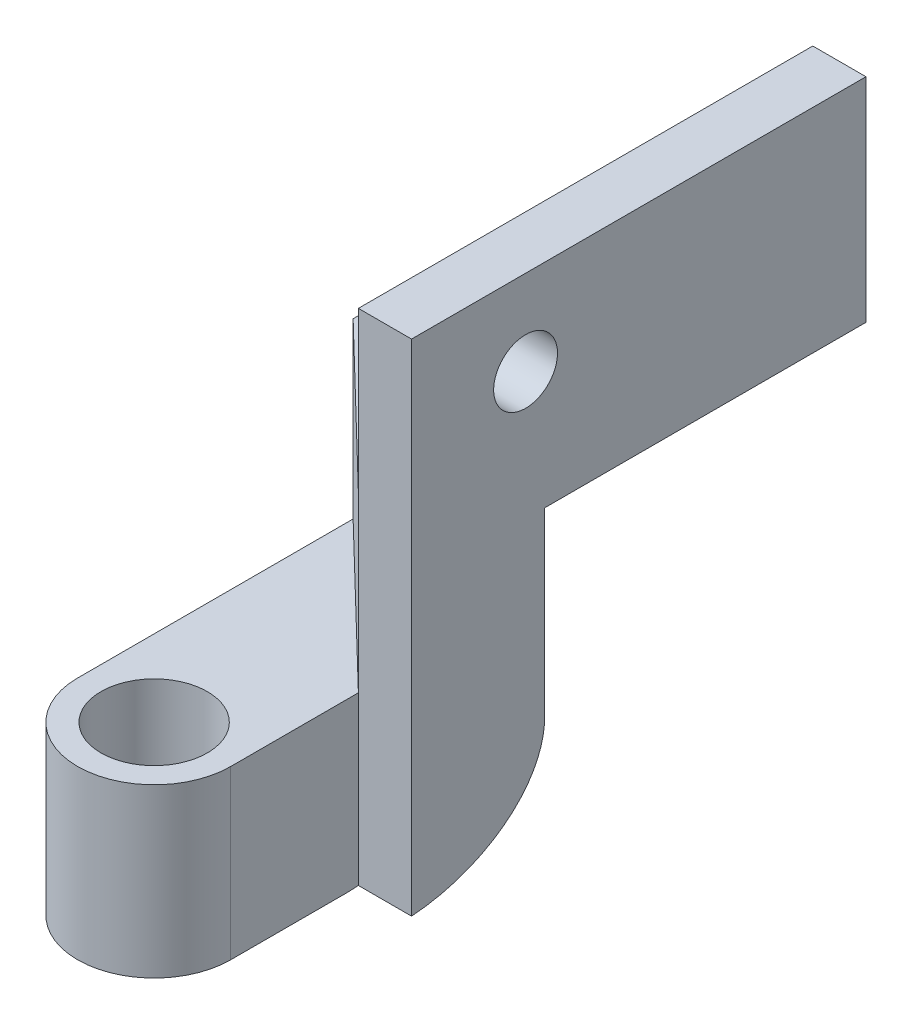
ISO-10303-21;
HEADER;
FILE_DESCRIPTION(('STEP AP214'),'2;1');
FILE_NAME('part.step','',(''),(''),'','','');
FILE_SCHEMA(('AUTOMOTIVE_DESIGN { 1 0 10303 214 1 1 1 1 }'));
ENDSEC;
DATA;
#1=APPLICATION_CONTEXT('core data for automotive mechanical design processes');
#2=APPLICATION_PROTOCOL_DEFINITION('international standard','automotive_design',2000,#1);
#3=PRODUCT_CONTEXT('',#1,'mechanical');
#4=PRODUCT('Part','Part','',(#3));
#5=PRODUCT_RELATED_PRODUCT_CATEGORY('part','',(#4));
#6=PRODUCT_DEFINITION_FORMATION('','',#4);
#7=PRODUCT_DEFINITION_CONTEXT('part definition',#1,'design');
#8=PRODUCT_DEFINITION('design','',#6,#7);
#9=PRODUCT_DEFINITION_SHAPE('','',#8);
#10=(LENGTH_UNIT() NAMED_UNIT(*) SI_UNIT(.MILLI.,.METRE.));
#11=(NAMED_UNIT(*) PLANE_ANGLE_UNIT() SI_UNIT($,.RADIAN.));
#12=(NAMED_UNIT(*) SI_UNIT($,.STERADIAN.) SOLID_ANGLE_UNIT());
#13=UNCERTAINTY_MEASURE_WITH_UNIT(LENGTH_MEASURE(1.E-05),#10,'distance_accuracy_value','');
#14=(GEOMETRIC_REPRESENTATION_CONTEXT(3) GLOBAL_UNCERTAINTY_ASSIGNED_CONTEXT((#13)) GLOBAL_UNIT_ASSIGNED_CONTEXT((#10,
#11,#12)) REPRESENTATION_CONTEXT('',''));
#15=CARTESIAN_POINT('',(0.,0.,0.));
#16=DIRECTION('',(0.,0.,1.));
#17=DIRECTION('',(1.,0.,0.));
#18=AXIS2_PLACEMENT_3D('',#15,#16,#17);
#19=CARTESIAN_POINT('',(3.59999999999999,-2.5,0.));
#20=DIRECTION('',(1.,0.,0.));
#21=DIRECTION('',(0.,0.,-1.));
#22=AXIS2_PLACEMENT_3D('',#19,#20,#21);
#23=PLANE('',#22);
#24=DIRECTION('',(0.,-1.,0.));
#25=VECTOR('',#24,1.);
#26=CARTESIAN_POINT('',(3.60000000000002,0.,-5.99999999999997));
#27=LINE('',#26,#25);
#28=CARTESIAN_POINT('',(3.60000000000002,-8.15,-5.99999999999997));
#29=VERTEX_POINT('',#28);
#30=CARTESIAN_POINT('',(3.60000000000002,-15.9949371855331,-5.99999999999998));
#31=VERTEX_POINT('',#30);
#32=EDGE_CURVE('E163',#29,#31,#27,.T.);
#33=ORIENTED_EDGE('',*,*,#32,.F.);
#34=DIRECTION('',(0.,0.,-1.));
#35=VECTOR('',#34,1.);
#36=CARTESIAN_POINT('',(3.59999999999999,-8.15,0.));
#37=LINE('',#36,#35);
#38=CARTESIAN_POINT('',(3.59999999999999,-8.15,0.));
#39=VERTEX_POINT('',#38);
#40=EDGE_CURVE('E183',#39,#29,#37,.T.);
#41=ORIENTED_EDGE('',*,*,#40,.F.);
#42=DIRECTION('',(0.,1.,0.));
#43=VECTOR('',#42,1.);
#44=CARTESIAN_POINT('',(3.59999999999999,-16.02,0.));
#45=LINE('',#44,#43);
#46=CARTESIAN_POINT('',(3.59999999999999,-16.02,0.));
#47=VERTEX_POINT('',#46);
#48=EDGE_CURVE('E186',#47,#39,#45,.T.);
#49=ORIENTED_EDGE('',*,*,#48,.F.);
#50=DIRECTION('',(0.,0.,1.));
#51=VECTOR('',#50,1.);
#52=CARTESIAN_POINT('',(3.59999999999999,-16.02,0.));
#53=LINE('',#52,#51);
#54=CARTESIAN_POINT('',(3.60000000000002,-16.02,-5.30491820449164));
#55=VERTEX_POINT('',#54);
#56=EDGE_CURVE('E194',#55,#47,#53,.T.);
#57=ORIENTED_EDGE('',*,*,#56,.F.);
#58=CARTESIAN_POINT('',(3.60000000000002,-11.02,-5.30491820449164));
#59=DIRECTION('',(1.,0.,0.));
#60=DIRECTION('',(0.,0.,-1.));
#61=AXIS2_PLACEMENT_3D('',#58,#59,#60);
#62=ELLIPSE('',#61,6.95081795508332,5.);
#63=EDGE_CURVE('E11',#55,#31,#62,.T.);
#64=ORIENTED_EDGE('',*,*,#63,.T.);
#65=EDGE_LOOP('',(#33,#41,#49,#57,#64));
#66=FACE_BOUND('',#65,.T.);
#67=ADVANCED_FACE('F41',(#66),#23,.T.);
#68=CARTESIAN_POINT('',(4.73535338699276,-2.5,-4.9036019787419));
#69=DIRECTION('',(-0.694658370458993,0.,0.719339800338655));
#70=DIRECTION('',(0.719339800338655,0.,0.694658370458993));
#71=AXIS2_PLACEMENT_3D('',#68,#69,#70);
#72=PLANE('',#71);
#73=DIRECTION('',(0.,1.,0.));
#74=VECTOR('',#73,1.);
#75=CARTESIAN_POINT('',(-3.59999999999999,-2.5,-12.9529591786108));
#76=LINE('',#75,#74);
#77=CARTESIAN_POINT('',(-3.59999999999999,-8.15,-12.9529591786108));
#78=VERTEX_POINT('',#77);
#79=CARTESIAN_POINT('',(-3.59999999999999,0.,-12.9529591786108));
#80=VERTEX_POINT('',#79);
#81=EDGE_CURVE('E215',#78,#80,#76,.T.);
#82=ORIENTED_EDGE('',*,*,#81,.F.);
#83=DIRECTION('',(0.719339800338655,0.,0.694658370458993));
#84=VECTOR('',#83,1.);
#85=CARTESIAN_POINT('',(4.73535338699276,-8.15,-4.9036019787419));
#86=LINE('',#85,#84);
#87=EDGE_CURVE('E174',#78,#29,#86,.T.);
#88=ORIENTED_EDGE('',*,*,#87,.T.);
#89=DIRECTION('',(0.,1.,0.));
#90=VECTOR('',#89,1.);
#91=CARTESIAN_POINT('',(3.60000000000002,-2.5,-5.99999999999997));
#92=LINE('',#91,#90);
#93=CARTESIAN_POINT('',(3.60000000000002,0.,-5.99999999999997));
#94=VERTEX_POINT('',#93);
#95=EDGE_CURVE('E226',#29,#94,#92,.T.);
#96=ORIENTED_EDGE('',*,*,#95,.T.);
#97=DIRECTION('',(0.719339800338655,0.,0.694658370458993));
#98=VECTOR('',#97,1.);
#99=CARTESIAN_POINT('',(4.73535338699276,0.,-4.9036019787419));
#100=LINE('',#99,#98);
#101=EDGE_CURVE('E220',#80,#94,#100,.T.);
#102=ORIENTED_EDGE('',*,*,#101,.F.);
#103=EDGE_LOOP('',(#82,#88,#96,#102));
#104=FACE_BOUND('',#103,.T.);
#105=ADVANCED_FACE('F307',(#104),#72,.T.);
#106=CARTESIAN_POINT('',(0.,-2.5,0.));
#107=DIRECTION('',(0.,1.,0.));
#108=DIRECTION('',(0.,0.,1.));
#109=AXIS2_PLACEMENT_3D('',#106,#107,#108);
#110=PLANE('',#109);
#111=CARTESIAN_POINT('',(-0.400000000000008,-2.5,-21.36));
#112=DIRECTION('',(0.,1.,0.));
#113=DIRECTION('',(0.,0.,1.));
#114=AXIS2_PLACEMENT_3D('',#111,#112,#113);
#115=CIRCLE('',#114,1.5);
#116=CARTESIAN_POINT('',(-0.400000000000008,-2.5,-19.86));
#117=VERTEX_POINT('',#116);
#118=EDGE_CURVE('E204',#117,#117,#115,.T.);
#119=ORIENTED_EDGE('',*,*,#118,.T.);
#120=EDGE_LOOP('',(#119));
#121=FACE_BOUND('',#120,.T.);
#122=DIRECTION('',(0.719339800338655,0.,0.694658370458993));
#123=VECTOR('',#122,1.);
#124=CARTESIAN_POINT('',(7.86131605405823,-2.5,-8.14063108026585));
#125=LINE('',#124,#123);
#126=CARTESIAN_POINT('',(-3.59999999999999,-2.5,-19.2086953381859));
#127=VERTEX_POINT('',#126);
#128=CARTESIAN_POINT('',(3.60000000000006,-2.5,-12.255736159575));
#129=VERTEX_POINT('',#128);
#130=EDGE_CURVE('E227',#127,#129,#125,.T.);
#131=ORIENTED_EDGE('',*,*,#130,.F.);
#132=DIRECTION('',(0.,0.,1.));
#133=VECTOR('',#132,1.);
#134=CARTESIAN_POINT('',(-3.59999999999999,-2.5,0.));
#135=LINE('',#134,#133);
#136=CARTESIAN_POINT('',(-3.6,-2.5,-27.36));
#137=VERTEX_POINT('',#136);
#138=EDGE_CURVE('E201',#137,#127,#135,.T.);
#139=ORIENTED_EDGE('',*,*,#138,.F.);
#140=DIRECTION('',(-1.,0.,0.));
#141=VECTOR('',#140,1.);
#142=CARTESIAN_POINT('',(0.,-2.5,-27.36));
#143=LINE('',#142,#141);
#144=CARTESIAN_POINT('',(6.10000000000014,-2.5,-27.3599999999999));
#145=VERTEX_POINT('',#144);
#146=EDGE_CURVE('E209',#145,#137,#143,.T.);
#147=ORIENTED_EDGE('',*,*,#146,.F.);
#148=DIRECTION('',(0.,0.,-1.));
#149=VECTOR('',#148,1.);
#150=CARTESIAN_POINT('',(6.09999999999999,-2.5,0.));
#151=LINE('',#150,#149);
#152=CARTESIAN_POINT('',(6.10000000000006,-2.5,-12.2557361595749));
#153=VERTEX_POINT('',#152);
#154=EDGE_CURVE('E260',#153,#145,#151,.T.);
#155=ORIENTED_EDGE('',*,*,#154,.F.);
#156=DIRECTION('',(-1.,0.,0.));
#157=VECTOR('',#156,1.);
#158=CARTESIAN_POINT('',(6.10000000000006,-2.5,-12.2557361595749));
#159=LINE('',#158,#157);
#160=EDGE_CURVE('E170',#153,#129,#159,.T.);
#161=ORIENTED_EDGE('',*,*,#160,.T.);
#162=EDGE_LOOP('',(#131,#139,#147,#155,#161));
#163=FACE_BOUND('',#162,.T.);
#164=ADVANCED_FACE('F244',(#121,#163),#110,.F.);
#165=CARTESIAN_POINT('',(-3.59999999999999,-2.5,0.));
#166=DIRECTION('',(-1.,0.,0.));
#167=DIRECTION('',(0.,0.,1.));
#168=AXIS2_PLACEMENT_3D('',#165,#166,#167);
#169=PLANE('',#168);
#170=DIRECTION('',(0.,1.,0.));
#171=VECTOR('',#170,1.);
#172=CARTESIAN_POINT('',(-3.59999999999999,-31.0635910784963,-19.2086953381859));
#173=LINE('',#172,#171);
#174=CARTESIAN_POINT('',(-3.59999999999999,-11.02,-19.2086953381859));
#175=VERTEX_POINT('',#174);
#176=EDGE_CURVE('E192',#175,#127,#173,.T.);
#177=ORIENTED_EDGE('',*,*,#176,.F.);
#178=CARTESIAN_POINT('',(-3.59999999999999,-11.02,-12.2578773831025));
#179=DIRECTION('',(-1.,0.,0.));
#180=DIRECTION('',(0.,0.,-1.));
#181=AXIS2_PLACEMENT_3D('',#178,#179,#180);
#182=ELLIPSE('',#181,6.95081795508336,5.);
#183=CARTESIAN_POINT('',(-3.59999999999999,-16.02,-12.2578773831025));
#184=VERTEX_POINT('',#183);
#185=EDGE_CURVE('E64',#175,#184,#182,.T.);
#186=ORIENTED_EDGE('',*,*,#185,.T.);
#187=DIRECTION('',(0.,0.,-1.));
#188=VECTOR('',#187,1.);
#189=CARTESIAN_POINT('',(-3.59999999999999,-16.02,0.));
#190=LINE('',#189,#188);
#191=CARTESIAN_POINT('',(-3.59999999999999,-16.02,0.));
#192=VERTEX_POINT('',#191);
#193=EDGE_CURVE('E193',#192,#184,#190,.T.);
#194=ORIENTED_EDGE('',*,*,#193,.F.);
#195=DIRECTION('',(0.,1.,0.));
#196=VECTOR('',#195,1.);
#197=CARTESIAN_POINT('',(-3.59999999999999,-16.02,0.));
#198=LINE('',#197,#196);
#199=CARTESIAN_POINT('',(-3.59999999999999,-8.15,0.));
#200=VERTEX_POINT('',#199);
#201=EDGE_CURVE('E180',#192,#200,#198,.T.);
#202=ORIENTED_EDGE('',*,*,#201,.T.);
#203=DIRECTION('',(0.,0.,1.));
#204=VECTOR('',#203,1.);
#205=CARTESIAN_POINT('',(-3.59999999999999,-8.15,0.));
#206=LINE('',#205,#204);
#207=EDGE_CURVE('E164',#78,#200,#206,.T.);
#208=ORIENTED_EDGE('',*,*,#207,.F.);
#209=ORIENTED_EDGE('',*,*,#81,.T.);
#210=DIRECTION('',(0.,0.,1.));
#211=VECTOR('',#210,1.);
#212=CARTESIAN_POINT('',(-3.59999999999999,0.,0.));
#213=LINE('',#212,#211);
#214=CARTESIAN_POINT('',(-3.6,0.,-27.36));
#215=VERTEX_POINT('',#214);
#216=EDGE_CURVE('E213',#215,#80,#213,.T.);
#217=ORIENTED_EDGE('',*,*,#216,.F.);
#218=DIRECTION('',(0.,1.,0.));
#219=VECTOR('',#218,1.);
#220=CARTESIAN_POINT('',(-3.6,-2.5,-27.36));
#221=LINE('',#220,#219);
#222=EDGE_CURVE('E221',#137,#215,#221,.T.);
#223=ORIENTED_EDGE('',*,*,#222,.F.);
#224=ORIENTED_EDGE('',*,*,#138,.T.);
#225=EDGE_LOOP('',(#177,#186,#194,#202,#208,#209,#217,#223,#224));
#226=FACE_BOUND('',#225,.T.);
#227=ADVANCED_FACE('F241',(#226),#169,.T.);
#228=CARTESIAN_POINT('',(0.,-2.5,-27.36));
#229=DIRECTION('',(0.,0.,-1.));
#230=DIRECTION('',(-1.,0.,0.));
#231=AXIS2_PLACEMENT_3D('',#228,#229,#230);
#232=PLANE('',#231);
#233=DIRECTION('',(-1.,0.,0.));
#234=VECTOR('',#233,1.);
#235=CARTESIAN_POINT('',(0.,0.,-27.36));
#236=LINE('',#235,#234);
#237=CARTESIAN_POINT('',(3.60000000000014,0.,-27.36));
#238=VERTEX_POINT('',#237);
#239=EDGE_CURVE('E207',#238,#215,#236,.T.);
#240=ORIENTED_EDGE('',*,*,#239,.F.);
#241=DIRECTION('',(0.,1.,0.));
#242=VECTOR('',#241,1.);
#243=CARTESIAN_POINT('',(3.60000000000014,0.,-27.36));
#244=LINE('',#243,#242);
#245=CARTESIAN_POINT('',(3.60000000000014,7.5,-27.36));
#246=VERTEX_POINT('',#245);
#247=EDGE_CURVE('E272',#238,#246,#244,.T.);
#248=ORIENTED_EDGE('',*,*,#247,.T.);
#249=DIRECTION('',(-1.,0.,0.));
#250=VECTOR('',#249,1.);
#251=CARTESIAN_POINT('',(6.10000000000014,7.5,-27.3599999999999));
#252=LINE('',#251,#250);
#253=CARTESIAN_POINT('',(6.10000000000014,7.5,-27.3599999999999));
#254=VERTEX_POINT('',#253);
#255=EDGE_CURVE('E257',#254,#246,#252,.T.);
#256=ORIENTED_EDGE('',*,*,#255,.F.);
#257=DIRECTION('',(0.,1.,0.));
#258=VECTOR('',#257,1.);
#259=CARTESIAN_POINT('',(6.10000000000014,0.,-27.3599999999999));
#260=LINE('',#259,#258);
#261=EDGE_CURVE('E251',#145,#254,#260,.T.);
#262=ORIENTED_EDGE('',*,*,#261,.F.);
#263=ORIENTED_EDGE('',*,*,#146,.T.);
#264=ORIENTED_EDGE('',*,*,#222,.T.);
#265=EDGE_LOOP('',(#240,#248,#256,#262,#263,#264));
#266=FACE_BOUND('',#265,.T.);
#267=ADVANCED_FACE('F255',(#266),#232,.T.);
#268=CARTESIAN_POINT('',(-0.400000000000008,-2.5,-21.36));
#269=DIRECTION('',(0.,1.,0.));
#270=DIRECTION('',(0.,0.,1.));
#271=AXIS2_PLACEMENT_3D('',#268,#269,#270);
#272=CYLINDRICAL_SURFACE('',#271,1.5);
#273=ORIENTED_EDGE('',*,*,#118,.F.);
#274=EDGE_LOOP('',(#273));
#275=FACE_BOUND('',#274,.T.);
#276=CARTESIAN_POINT('',(-0.400000000000008,0.,-21.36));
#277=DIRECTION('',(0.,1.,0.));
#278=DIRECTION('',(0.,0.,1.));
#279=AXIS2_PLACEMENT_3D('',#276,#277,#278);
#280=CIRCLE('',#279,1.5);
#281=CARTESIAN_POINT('',(-0.400000000000008,0.,-19.86));
#282=VERTEX_POINT('',#281);
#283=EDGE_CURVE('E203',#282,#282,#280,.T.);
#284=ORIENTED_EDGE('',*,*,#283,.T.);
#285=EDGE_LOOP('',(#284));
#286=FACE_BOUND('',#285,.T.);
#287=ADVANCED_FACE('F312',(#275,#286),#272,.F.);
#288=CARTESIAN_POINT('',(0.,0.,0.));
#289=DIRECTION('',(0.,1.,0.));
#290=DIRECTION('',(0.,0.,1.));
#291=AXIS2_PLACEMENT_3D('',#288,#289,#290);
#292=PLANE('',#291);
#293=DIRECTION('',(0.,0.,-1.));
#294=VECTOR('',#293,1.);
#295=CARTESIAN_POINT('',(3.59999999999999,0.,0.));
#296=LINE('',#295,#294);
#297=EDGE_CURVE('E223',#94,#238,#296,.T.);
#298=ORIENTED_EDGE('',*,*,#297,.T.);
#299=ORIENTED_EDGE('',*,*,#239,.T.);
#300=ORIENTED_EDGE('',*,*,#216,.T.);
#301=ORIENTED_EDGE('',*,*,#101,.T.);
#302=EDGE_LOOP('',(#298,#299,#300,#301));
#303=FACE_BOUND('',#302,.T.);
#304=ORIENTED_EDGE('',*,*,#283,.F.);
#305=EDGE_LOOP('',(#304));
#306=FACE_BOUND('',#305,.T.);
#307=ADVANCED_FACE('F306',(#303,#306),#292,.T.);
#308=CARTESIAN_POINT('',(7.86131605405823,-31.0635910784963,-8.14063108026585));
#309=DIRECTION('',(-0.694658370458993,0.,0.719339800338655));
#310=DIRECTION('',(0.719339800338655,0.,0.694658370458993));
#311=AXIS2_PLACEMENT_3D('',#308,#309,#310);
#312=PLANE('',#311);
#313=DIRECTION('',(0.,1.,0.));
#314=VECTOR('',#313,1.);
#315=CARTESIAN_POINT('',(3.60000000000006,-31.0635910784963,-12.255736159575));
#316=LINE('',#315,#314);
#317=CARTESIAN_POINT('',(3.60000000000006,-11.02,-12.255736159575));
#318=VERTEX_POINT('',#317);
#319=EDGE_CURVE('E199',#318,#129,#316,.T.);
#320=ORIENTED_EDGE('',*,*,#319,.F.);
#321=DIRECTION('',(-0.719339800338655,0.,-0.694658370458993));
#322=VECTOR('',#321,1.);
#323=CARTESIAN_POINT('',(7.86131605405823,-11.02,-8.14063108026585));
#324=LINE('',#323,#322);
#325=EDGE_CURVE('E235',#318,#175,#324,.T.);
#326=ORIENTED_EDGE('',*,*,#325,.T.);
#327=ORIENTED_EDGE('',*,*,#176,.T.);
#328=ORIENTED_EDGE('',*,*,#130,.T.);
#329=EDGE_LOOP('',(#320,#326,#327,#328));
#330=FACE_BOUND('',#329,.T.);
#331=ADVANCED_FACE('F240',(#330),#312,.F.);
#332=CARTESIAN_POINT('',(0.,-16.02,0.));
#333=DIRECTION('',(0.,1.,0.));
#334=DIRECTION('',(0.,0.,1.));
#335=AXIS2_PLACEMENT_3D('',#332,#333,#334);
#336=PLANE('',#335);
#337=ORIENTED_EDGE('',*,*,#193,.T.);
#338=DIRECTION('',(-0.719339800338655,0.,-0.694658370458993));
#339=VECTOR('',#338,1.);
#340=CARTESIAN_POINT('',(4.38802420176326,-16.02,-4.54393207857258));
#341=LINE('',#340,#339);
#342=EDGE_CURVE('E47',#184,#55,#341,.F.);
#343=ORIENTED_EDGE('',*,*,#342,.T.);
#344=ORIENTED_EDGE('',*,*,#56,.T.);
#345=CARTESIAN_POINT('',(0.,-16.02,0.));
#346=DIRECTION('',(0.,1.,0.));
#347=DIRECTION('',(0.,0.,1.));
#348=AXIS2_PLACEMENT_3D('',#345,#346,#347);
#349=CIRCLE('',#348,3.59999999999999);
#350=EDGE_CURVE('E172',#192,#47,#349,.T.);
#351=ORIENTED_EDGE('',*,*,#350,.F.);
#352=EDGE_LOOP('',(#337,#343,#344,#351));
#353=FACE_BOUND('',#352,.T.);
#354=CARTESIAN_POINT('',(0.,-16.02,0.));
#355=DIRECTION('',(0.,1.,0.));
#356=DIRECTION('',(0.,0.,1.));
#357=AXIS2_PLACEMENT_3D('',#354,#355,#356);
#358=CIRCLE('',#357,2.5);
#359=CARTESIAN_POINT('',(0.,-16.02,2.5));
#360=VERTEX_POINT('',#359);
#361=EDGE_CURVE('E171',#360,#360,#358,.T.);
#362=ORIENTED_EDGE('',*,*,#361,.T.);
#363=EDGE_LOOP('',(#362));
#364=FACE_BOUND('',#363,.T.);
#365=ADVANCED_FACE('F297',(#353,#364),#336,.F.);
#366=CARTESIAN_POINT('',(0.,-16.02,0.));
#367=DIRECTION('',(0.,1.,0.));
#368=DIRECTION('',(0.,0.,1.));
#369=AXIS2_PLACEMENT_3D('',#366,#367,#368);
#370=CYLINDRICAL_SURFACE('',#369,2.5);
#371=ORIENTED_EDGE('',*,*,#361,.F.);
#372=EDGE_LOOP('',(#371));
#373=FACE_BOUND('',#372,.T.);
#374=CARTESIAN_POINT('',(0.,-8.15,0.));
#375=DIRECTION('',(0.,1.,0.));
#376=DIRECTION('',(0.,0.,1.));
#377=AXIS2_PLACEMENT_3D('',#374,#375,#376);
#378=CIRCLE('',#377,2.5);
#379=CARTESIAN_POINT('',(0.,-8.15,2.5));
#380=VERTEX_POINT('',#379);
#381=EDGE_CURVE('E162',#380,#380,#378,.T.);
#382=ORIENTED_EDGE('',*,*,#381,.T.);
#383=EDGE_LOOP('',(#382));
#384=FACE_BOUND('',#383,.T.);
#385=ADVANCED_FACE('F298',(#373,#384),#370,.F.);
#386=CARTESIAN_POINT('',(0.,-16.02,0.));
#387=DIRECTION('',(0.,1.,0.));
#388=DIRECTION('',(0.,0.,1.));
#389=AXIS2_PLACEMENT_3D('',#386,#387,#388);
#390=CYLINDRICAL_SURFACE('',#389,3.59999999999999);
#391=CARTESIAN_POINT('',(0.,-8.15,0.));
#392=DIRECTION('',(0.,1.,0.));
#393=DIRECTION('',(0.,0.,1.));
#394=AXIS2_PLACEMENT_3D('',#391,#392,#393);
#395=CIRCLE('',#394,3.59999999999999);
#396=EDGE_CURVE('E181',#200,#39,#395,.T.);
#397=ORIENTED_EDGE('',*,*,#396,.F.);
#398=ORIENTED_EDGE('',*,*,#201,.F.);
#399=ORIENTED_EDGE('',*,*,#350,.T.);
#400=ORIENTED_EDGE('',*,*,#48,.T.);
#401=EDGE_LOOP('',(#397,#398,#399,#400));
#402=FACE_BOUND('',#401,.T.);
#403=ADVANCED_FACE('F292',(#402),#390,.T.);
#404=CARTESIAN_POINT('',(0.,-8.15,0.));
#405=DIRECTION('',(0.,1.,0.));
#406=DIRECTION('',(0.,0.,1.));
#407=AXIS2_PLACEMENT_3D('',#404,#405,#406);
#408=PLANE('',#407);
#409=ORIENTED_EDGE('',*,*,#381,.F.);
#410=EDGE_LOOP('',(#409));
#411=FACE_BOUND('',#410,.T.);
#412=ORIENTED_EDGE('',*,*,#207,.T.);
#413=ORIENTED_EDGE('',*,*,#396,.T.);
#414=ORIENTED_EDGE('',*,*,#40,.T.);
#415=ORIENTED_EDGE('',*,*,#87,.F.);
#416=EDGE_LOOP('',(#412,#413,#414,#415));
#417=FACE_BOUND('',#416,.T.);
#418=ADVANCED_FACE('F290',(#411,#417),#408,.T.);
#419=CARTESIAN_POINT('',(4.38802420176326,-11.02,-4.54393207857258));
#420=DIRECTION('',(-0.719339800338655,0.,-0.694658370458993));
#421=DIRECTION('',(-0.694658370458993,0.,0.719339800338655));
#422=AXIS2_PLACEMENT_3D('',#419,#420,#421);
#423=CYLINDRICAL_SURFACE('',#422,5.);
#424=ORIENTED_EDGE('',*,*,#63,.F.);
#425=ORIENTED_EDGE('',*,*,#342,.F.);
#426=ORIENTED_EDGE('',*,*,#185,.F.);
#427=ORIENTED_EDGE('',*,*,#325,.F.);
#428=CARTESIAN_POINT('',(3.60000000000002,-11.02,-5.30491820449164));
#429=DIRECTION('',(1.,0.,0.));
#430=DIRECTION('',(0.,0.,-1.));
#431=AXIS2_PLACEMENT_3D('',#428,#429,#430);
#432=ELLIPSE('',#431,6.95081795508332,5.);
#433=EDGE_CURVE('E270',#31,#318,#432,.T.);
#434=ORIENTED_EDGE('',*,*,#433,.F.);
#435=EDGE_LOOP('',(#424,#425,#426,#427,#434));
#436=FACE_BOUND('',#435,.T.);
#437=ADVANCED_FACE('F43',(#436),#423,.T.);
#438=CARTESIAN_POINT('',(6.10000000000002,0.,-5.99999999999996));
#439=DIRECTION('',(0.,0.,-1.));
#440=DIRECTION('',(-1.,0.,0.));
#441=AXIS2_PLACEMENT_3D('',#438,#439,#440);
#442=PLANE('',#441);
#443=CARTESIAN_POINT('',(3.60000000000002,7.5,-5.99999999999997));
#444=VERTEX_POINT('',#443);
#445=EDGE_CURVE('E269',#444,#94,#27,.T.);
#446=ORIENTED_EDGE('',*,*,#445,.T.);
#447=ORIENTED_EDGE('',*,*,#95,.F.);
#448=ORIENTED_EDGE('',*,*,#32,.T.);
#449=DIRECTION('',(-1.,0.,0.));
#450=VECTOR('',#449,1.);
#451=CARTESIAN_POINT('',(6.10000000000002,-15.9949371855331,-5.99999999999997));
#452=LINE('',#451,#450);
#453=CARTESIAN_POINT('',(6.10000000000002,-15.9949371855331,-5.99999999999997));
#454=VERTEX_POINT('',#453);
#455=EDGE_CURVE('E140',#454,#31,#452,.T.);
#456=ORIENTED_EDGE('',*,*,#455,.F.);
#457=DIRECTION('',(0.,-1.,0.));
#458=VECTOR('',#457,1.);
#459=CARTESIAN_POINT('',(6.10000000000002,0.,-5.99999999999996));
#460=LINE('',#459,#458);
#461=CARTESIAN_POINT('',(6.10000000000002,7.5,-5.99999999999996));
#462=VERTEX_POINT('',#461);
#463=EDGE_CURVE('E143',#462,#454,#460,.T.);
#464=ORIENTED_EDGE('',*,*,#463,.F.);
#465=DIRECTION('',(-1.,0.,0.));
#466=VECTOR('',#465,1.);
#467=CARTESIAN_POINT('',(6.10000000000002,7.5,-5.99999999999996));
#468=LINE('',#467,#466);
#469=EDGE_CURVE('E268',#462,#444,#468,.T.);
#470=ORIENTED_EDGE('',*,*,#469,.T.);
#471=EDGE_LOOP('',(#446,#447,#448,#456,#464,#470));
#472=FACE_BOUND('',#471,.T.);
#473=ADVANCED_FACE('F160',(#472),#442,.F.);
#474=CARTESIAN_POINT('',(6.10000000000002,-11.02,-5.30491820449163));
#475=DIRECTION('',(1.,0.,0.));
#476=DIRECTION('',(0.,0.,-1.));
#477=AXIS2_PLACEMENT_3D('',#474,#475,#476);
#478=ELLIPSE('',#477,6.95081795508332,5.);
#479=DIRECTION('',(-1.,0.,0.));
#480=VECTOR('',#479,1.);
#481=SURFACE_OF_LINEAR_EXTRUSION('',#478,#480);
#482=ORIENTED_EDGE('',*,*,#433,.T.);
#483=DIRECTION('',(-1.,0.,0.));
#484=VECTOR('',#483,1.);
#485=CARTESIAN_POINT('',(6.10000000000006,-11.02,-12.2557361595749));
#486=LINE('',#485,#484);
#487=CARTESIAN_POINT('',(6.10000000000006,-11.02,-12.2557361595749));
#488=VERTEX_POINT('',#487);
#489=EDGE_CURVE('E142',#488,#318,#486,.T.);
#490=ORIENTED_EDGE('',*,*,#489,.F.);
#491=EDGE_CURVE('E133',#454,#488,#478,.T.);
#492=ORIENTED_EDGE('',*,*,#491,.F.);
#493=ORIENTED_EDGE('',*,*,#455,.T.);
#494=EDGE_LOOP('',(#482,#490,#492,#493));
#495=FACE_BOUND('',#494,.T.);
#496=ADVANCED_FACE('F139',(#495),#481,.F.);
#497=CARTESIAN_POINT('',(6.10000000000006,0.,-12.2557361595749));
#498=DIRECTION('',(0.,0.,1.));
#499=DIRECTION('',(1.,0.,0.));
#500=AXIS2_PLACEMENT_3D('',#497,#498,#499);
#501=PLANE('',#500);
#502=ORIENTED_EDGE('',*,*,#319,.T.);
#503=ORIENTED_EDGE('',*,*,#160,.F.);
#504=DIRECTION('',(0.,1.,0.));
#505=VECTOR('',#504,1.);
#506=CARTESIAN_POINT('',(6.10000000000006,0.,-12.2557361595749));
#507=LINE('',#506,#505);
#508=EDGE_CURVE('E144',#488,#153,#507,.T.);
#509=ORIENTED_EDGE('',*,*,#508,.F.);
#510=ORIENTED_EDGE('',*,*,#489,.T.);
#511=EDGE_LOOP('',(#502,#503,#509,#510));
#512=FACE_BOUND('',#511,.T.);
#513=ADVANCED_FACE('F278',(#512),#501,.F.);
#514=CARTESIAN_POINT('',(6.09999999999999,7.5,0.));
#515=DIRECTION('',(0.,-1.,0.));
#516=DIRECTION('',(0.,0.,-1.));
#517=AXIS2_PLACEMENT_3D('',#514,#515,#516);
#518=PLANE('',#517);
#519=DIRECTION('',(0.,0.,1.));
#520=VECTOR('',#519,1.);
#521=CARTESIAN_POINT('',(3.59999999999999,7.5,0.));
#522=LINE('',#521,#520);
#523=EDGE_CURVE('E271',#246,#444,#522,.T.);
#524=ORIENTED_EDGE('',*,*,#523,.T.);
#525=ORIENTED_EDGE('',*,*,#469,.F.);
#526=DIRECTION('',(0.,0.,1.));
#527=VECTOR('',#526,1.);
#528=CARTESIAN_POINT('',(6.09999999999999,7.5,0.));
#529=LINE('',#528,#527);
#530=EDGE_CURVE('E154',#254,#462,#529,.T.);
#531=ORIENTED_EDGE('',*,*,#530,.F.);
#532=ORIENTED_EDGE('',*,*,#255,.T.);
#533=EDGE_LOOP('',(#524,#525,#531,#532));
#534=FACE_BOUND('',#533,.T.);
#535=ADVANCED_FACE('F415',(#534),#518,.F.);
#536=CARTESIAN_POINT('',(6.10000000000005,3.5,-11.3599999999999));
#537=DIRECTION('',(-1.,0.,0.));
#538=DIRECTION('',(0.,0.,1.));
#539=AXIS2_PLACEMENT_3D('',#536,#537,#538);
#540=CYLINDRICAL_SURFACE('',#539,1.5);
#541=CARTESIAN_POINT('',(6.10000000000005,3.5,-11.3599999999999));
#542=DIRECTION('',(1.,0.,0.));
#543=DIRECTION('',(0.,0.,-1.));
#544=AXIS2_PLACEMENT_3D('',#541,#542,#543);
#545=CIRCLE('',#544,1.5);
#546=CARTESIAN_POINT('',(6.10000000000006,3.5,-12.8599999999999));
#547=VERTEX_POINT('',#546);
#548=EDGE_CURVE('E256',#547,#547,#545,.T.);
#549=ORIENTED_EDGE('',*,*,#548,.T.);
#550=EDGE_LOOP('',(#549));
#551=FACE_BOUND('',#550,.T.);
#552=CARTESIAN_POINT('',(3.60000000000005,3.5,-11.36));
#553=DIRECTION('',(1.,0.,0.));
#554=DIRECTION('',(0.,0.,-1.));
#555=AXIS2_PLACEMENT_3D('',#552,#553,#554);
#556=CIRCLE('',#555,1.5);
#557=CARTESIAN_POINT('',(3.60000000000006,3.5,-12.86));
#558=VERTEX_POINT('',#557);
#559=EDGE_CURVE('E152',#558,#558,#556,.T.);
#560=ORIENTED_EDGE('',*,*,#559,.F.);
#561=EDGE_LOOP('',(#560));
#562=FACE_BOUND('',#561,.T.);
#563=ADVANCED_FACE('F420',(#551,#562),#540,.F.);
#564=CARTESIAN_POINT('',(6.09999999999999,0.,0.));
#565=DIRECTION('',(1.,0.,0.));
#566=DIRECTION('',(0.,0.,-1.));
#567=AXIS2_PLACEMENT_3D('',#564,#565,#566);
#568=PLANE('',#567);
#569=ORIENTED_EDGE('',*,*,#463,.T.);
#570=ORIENTED_EDGE('',*,*,#491,.T.);
#571=ORIENTED_EDGE('',*,*,#508,.T.);
#572=ORIENTED_EDGE('',*,*,#154,.T.);
#573=ORIENTED_EDGE('',*,*,#261,.T.);
#574=ORIENTED_EDGE('',*,*,#530,.T.);
#575=EDGE_LOOP('',(#569,#570,#571,#572,#573,#574));
#576=FACE_BOUND('',#575,.T.);
#577=ORIENTED_EDGE('',*,*,#548,.F.);
#578=EDGE_LOOP('',(#577));
#579=FACE_BOUND('',#578,.T.);
#580=ADVANCED_FACE('F149',(#576,#579),#568,.T.);
#581=CARTESIAN_POINT('',(3.59999999999999,0.,0.));
#582=DIRECTION('',(1.,0.,0.));
#583=DIRECTION('',(0.,0.,-1.));
#584=AXIS2_PLACEMENT_3D('',#581,#582,#583);
#585=PLANE('',#584);
#586=ORIENTED_EDGE('',*,*,#297,.F.);
#587=ORIENTED_EDGE('',*,*,#445,.F.);
#588=ORIENTED_EDGE('',*,*,#523,.F.);
#589=ORIENTED_EDGE('',*,*,#247,.F.);
#590=EDGE_LOOP('',(#586,#587,#588,#589));
#591=FACE_BOUND('',#590,.T.);
#592=ORIENTED_EDGE('',*,*,#559,.T.);
#593=EDGE_LOOP('',(#592));
#594=FACE_BOUND('',#593,.T.);
#595=ADVANCED_FACE('F436',(#591,#594),#585,.F.);
#596=CLOSED_SHELL('',(#67,#105,#164,#227,#267,#287,#307,#331,#365,#385,#403,#418,#437,#473,#496,
#513,#535,#563,#580,#595));
#597=MANIFOLD_SOLID_BREP('B2',#596);
#598=ADVANCED_BREP_SHAPE_REPRESENTATION('',(#18,#597),#14);
#599=SHAPE_DEFINITION_REPRESENTATION(#9,#598);
ENDSEC;
END-ISO-10303-21;
